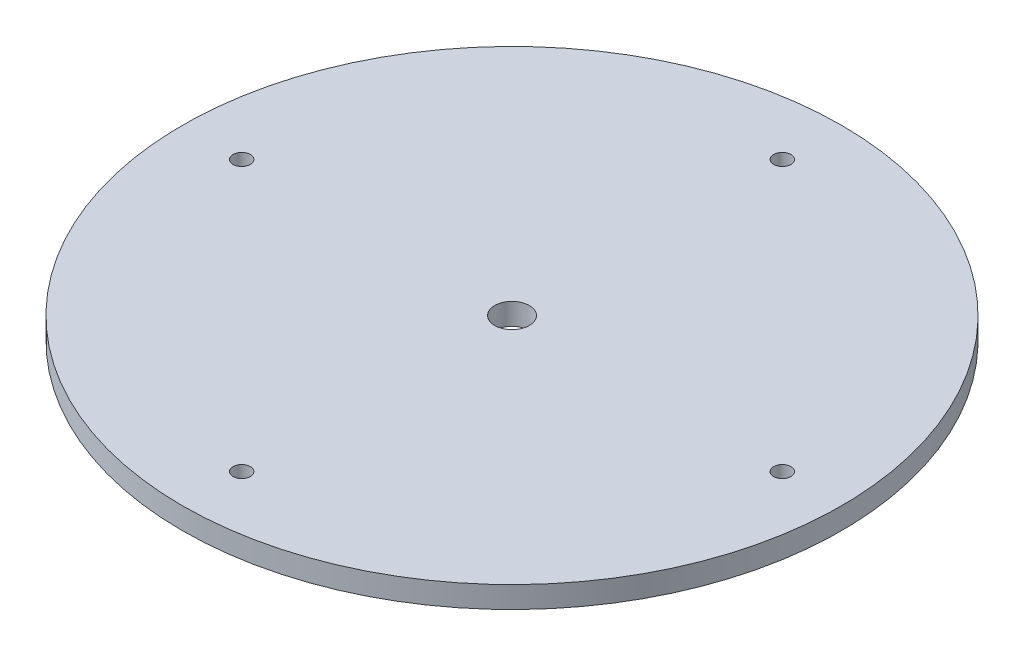
ISO-10303-21;
HEADER;
FILE_DESCRIPTION(('STEP AP214'),'2;1');
FILE_NAME('part.step','',(''),(''),'','','');
FILE_SCHEMA(('AUTOMOTIVE_DESIGN { 1 0 10303 214 1 1 1 1 }'));
ENDSEC;
DATA;
#1=APPLICATION_CONTEXT('core data for automotive mechanical design processes');
#2=APPLICATION_PROTOCOL_DEFINITION('international standard','automotive_design',2000,#1);
#3=PRODUCT_CONTEXT('',#1,'mechanical');
#4=PRODUCT('Part','Part','',(#3));
#5=PRODUCT_RELATED_PRODUCT_CATEGORY('part','',(#4));
#6=PRODUCT_DEFINITION_FORMATION('','',#4);
#7=PRODUCT_DEFINITION_CONTEXT('part definition',#1,'design');
#8=PRODUCT_DEFINITION('design','',#6,#7);
#9=PRODUCT_DEFINITION_SHAPE('','',#8);
#10=(LENGTH_UNIT() NAMED_UNIT(*) SI_UNIT(.MILLI.,.METRE.));
#11=(NAMED_UNIT(*) PLANE_ANGLE_UNIT() SI_UNIT($,.RADIAN.));
#12=(NAMED_UNIT(*) SI_UNIT($,.STERADIAN.) SOLID_ANGLE_UNIT());
#13=UNCERTAINTY_MEASURE_WITH_UNIT(LENGTH_MEASURE(1.E-05),#10,'distance_accuracy_value','');
#14=(GEOMETRIC_REPRESENTATION_CONTEXT(3) GLOBAL_UNCERTAINTY_ASSIGNED_CONTEXT((#13)) GLOBAL_UNIT_ASSIGNED_CONTEXT((#10,
#11,#12)) REPRESENTATION_CONTEXT('',''));
#15=CARTESIAN_POINT('',(0.,0.,0.));
#16=DIRECTION('',(0.,0.,1.));
#17=DIRECTION('',(1.,0.,0.));
#18=AXIS2_PLACEMENT_3D('',#15,#16,#17);
#19=CARTESIAN_POINT('',(0.,5.,0.));
#20=DIRECTION('',(0.,-1.,0.));
#21=DIRECTION('',(0.,0.,-1.));
#22=AXIS2_PLACEMENT_3D('',#19,#20,#21);
#23=CYLINDRICAL_SURFACE('',#22,4.);
#24=CARTESIAN_POINT('',(0.,5.,0.));
#25=DIRECTION('',(0.,1.,0.));
#26=DIRECTION('',(0.,0.,1.));
#27=AXIS2_PLACEMENT_3D('',#24,#25,#26);
#28=CIRCLE('',#27,4.);
#29=CARTESIAN_POINT('',(0.,5.,4.));
#30=VERTEX_POINT('',#29);
#31=EDGE_CURVE('E48',#30,#30,#28,.T.);
#32=ORIENTED_EDGE('',*,*,#31,.T.);
#33=EDGE_LOOP('',(#32));
#34=FACE_BOUND('',#33,.T.);
#35=CARTESIAN_POINT('',(0.,0.,0.));
#36=DIRECTION('',(0.,1.,0.));
#37=DIRECTION('',(0.,0.,1.));
#38=AXIS2_PLACEMENT_3D('',#35,#36,#37);
#39=CIRCLE('',#38,4.);
#40=CARTESIAN_POINT('',(0.,0.,4.));
#41=VERTEX_POINT('',#40);
#42=EDGE_CURVE('E56',#41,#41,#39,.T.);
#43=ORIENTED_EDGE('',*,*,#42,.F.);
#44=EDGE_LOOP('',(#43));
#45=FACE_BOUND('',#44,.T.);
#46=ADVANCED_FACE('F40',(#34,#45),#23,.F.);
#47=CARTESIAN_POINT('',(0.,5.,0.));
#48=DIRECTION('',(0.,-1.,0.));
#49=DIRECTION('',(0.,0.,-1.));
#50=AXIS2_PLACEMENT_3D('',#47,#48,#49);
#51=CYLINDRICAL_SURFACE('',#50,76.2);
#52=CARTESIAN_POINT('',(0.,5.,0.));
#53=DIRECTION('',(0.,1.,0.));
#54=DIRECTION('',(0.,0.,1.));
#55=AXIS2_PLACEMENT_3D('',#52,#53,#54);
#56=CIRCLE('',#55,76.2);
#57=CARTESIAN_POINT('',(0.,5.,76.2));
#58=VERTEX_POINT('',#57);
#59=EDGE_CURVE('E10',#58,#58,#56,.T.);
#60=ORIENTED_EDGE('',*,*,#59,.F.);
#61=EDGE_LOOP('',(#60));
#62=FACE_BOUND('',#61,.T.);
#63=CARTESIAN_POINT('',(0.,0.,0.));
#64=DIRECTION('',(0.,1.,0.));
#65=DIRECTION('',(0.,0.,1.));
#66=AXIS2_PLACEMENT_3D('',#63,#64,#65);
#67=CIRCLE('',#66,76.2);
#68=CARTESIAN_POINT('',(0.,0.,76.2));
#69=VERTEX_POINT('',#68);
#70=EDGE_CURVE('E43',#69,#69,#67,.T.);
#71=ORIENTED_EDGE('',*,*,#70,.T.);
#72=EDGE_LOOP('',(#71));
#73=FACE_BOUND('',#72,.T.);
#74=ADVANCED_FACE('F104',(#62,#73),#51,.T.);
#75=CARTESIAN_POINT('',(0.,5.,0.));
#76=DIRECTION('',(0.,1.,0.));
#77=DIRECTION('',(0.,0.,1.));
#78=AXIS2_PLACEMENT_3D('',#75,#76,#77);
#79=PLANE('',#78);
#80=CARTESIAN_POINT('',(0.,5.,62.5));
#81=DIRECTION('',(0.,1.,0.));
#82=DIRECTION('',(0.,0.,1.));
#83=AXIS2_PLACEMENT_3D('',#80,#81,#82);
#84=CIRCLE('',#83,2.);
#85=CARTESIAN_POINT('',(0.,5.,64.5));
#86=VERTEX_POINT('',#85);
#87=EDGE_CURVE('E66',#86,#86,#84,.T.);
#88=ORIENTED_EDGE('',*,*,#87,.F.);
#89=EDGE_LOOP('',(#88));
#90=FACE_BOUND('',#89,.T.);
#91=CARTESIAN_POINT('',(-62.5,5.,0.));
#92=DIRECTION('',(0.,1.,0.));
#93=DIRECTION('',(0.,0.,1.));
#94=AXIS2_PLACEMENT_3D('',#91,#92,#93);
#95=CIRCLE('',#94,2.);
#96=CARTESIAN_POINT('',(-62.5,5.,2.));
#97=VERTEX_POINT('',#96);
#98=EDGE_CURVE('E78',#97,#97,#95,.T.);
#99=ORIENTED_EDGE('',*,*,#98,.F.);
#100=EDGE_LOOP('',(#99));
#101=FACE_BOUND('',#100,.T.);
#102=CARTESIAN_POINT('',(0.,5.,-62.5));
#103=DIRECTION('',(0.,1.,0.));
#104=DIRECTION('',(0.,0.,1.));
#105=AXIS2_PLACEMENT_3D('',#102,#103,#104);
#106=CIRCLE('',#105,2.);
#107=CARTESIAN_POINT('',(0.,5.,-60.5));
#108=VERTEX_POINT('',#107);
#109=EDGE_CURVE('E86',#108,#108,#106,.T.);
#110=ORIENTED_EDGE('',*,*,#109,.F.);
#111=EDGE_LOOP('',(#110));
#112=FACE_BOUND('',#111,.T.);
#113=CARTESIAN_POINT('',(62.5,5.,0.));
#114=DIRECTION('',(0.,1.,0.));
#115=DIRECTION('',(0.,0.,1.));
#116=AXIS2_PLACEMENT_3D('',#113,#114,#115);
#117=CIRCLE('',#116,2.);
#118=CARTESIAN_POINT('',(62.5,5.,1.99999999999999));
#119=VERTEX_POINT('',#118);
#120=EDGE_CURVE('E93',#119,#119,#117,.T.);
#121=ORIENTED_EDGE('',*,*,#120,.F.);
#122=EDGE_LOOP('',(#121));
#123=FACE_BOUND('',#122,.T.);
#124=ORIENTED_EDGE('',*,*,#31,.F.);
#125=EDGE_LOOP('',(#124));
#126=FACE_BOUND('',#125,.T.);
#127=ORIENTED_EDGE('',*,*,#59,.T.);
#128=EDGE_LOOP('',(#127));
#129=FACE_BOUND('',#128,.T.);
#130=ADVANCED_FACE('F100',(#90,#101,#112,#123,#126,#129),#79,.T.);
#131=CARTESIAN_POINT('',(0.,0.,0.));
#132=DIRECTION('',(0.,1.,0.));
#133=DIRECTION('',(0.,0.,1.));
#134=AXIS2_PLACEMENT_3D('',#131,#132,#133);
#135=PLANE('',#134);
#136=CARTESIAN_POINT('',(0.,0.,62.5));
#137=DIRECTION('',(0.,1.,0.));
#138=DIRECTION('',(0.,0.,1.));
#139=AXIS2_PLACEMENT_3D('',#136,#137,#138);
#140=CIRCLE('',#139,2.);
#141=CARTESIAN_POINT('',(0.,0.,64.5));
#142=VERTEX_POINT('',#141);
#143=EDGE_CURVE('E59',#142,#142,#140,.T.);
#144=ORIENTED_EDGE('',*,*,#143,.T.);
#145=EDGE_LOOP('',(#144));
#146=FACE_BOUND('',#145,.T.);
#147=CARTESIAN_POINT('',(-62.5,0.,0.));
#148=DIRECTION('',(0.,1.,0.));
#149=DIRECTION('',(0.,0.,1.));
#150=AXIS2_PLACEMENT_3D('',#147,#148,#149);
#151=CIRCLE('',#150,2.);
#152=CARTESIAN_POINT('',(-62.5,0.,2.));
#153=VERTEX_POINT('',#152);
#154=EDGE_CURVE('E72',#153,#153,#151,.T.);
#155=ORIENTED_EDGE('',*,*,#154,.T.);
#156=EDGE_LOOP('',(#155));
#157=FACE_BOUND('',#156,.T.);
#158=CARTESIAN_POINT('',(0.,0.,-62.5));
#159=DIRECTION('',(0.,1.,0.));
#160=DIRECTION('',(0.,0.,1.));
#161=AXIS2_PLACEMENT_3D('',#158,#159,#160);
#162=CIRCLE('',#161,2.);
#163=CARTESIAN_POINT('',(0.,0.,-60.5));
#164=VERTEX_POINT('',#163);
#165=EDGE_CURVE('E82',#164,#164,#162,.T.);
#166=ORIENTED_EDGE('',*,*,#165,.T.);
#167=EDGE_LOOP('',(#166));
#168=FACE_BOUND('',#167,.T.);
#169=CARTESIAN_POINT('',(62.5,0.,0.));
#170=DIRECTION('',(0.,1.,0.));
#171=DIRECTION('',(0.,0.,1.));
#172=AXIS2_PLACEMENT_3D('',#169,#170,#171);
#173=CIRCLE('',#172,2.);
#174=CARTESIAN_POINT('',(62.5,0.,1.99999999999999));
#175=VERTEX_POINT('',#174);
#176=EDGE_CURVE('E90',#175,#175,#173,.T.);
#177=ORIENTED_EDGE('',*,*,#176,.T.);
#178=EDGE_LOOP('',(#177));
#179=FACE_BOUND('',#178,.T.);
#180=ORIENTED_EDGE('',*,*,#42,.T.);
#181=EDGE_LOOP('',(#180));
#182=FACE_BOUND('',#181,.T.);
#183=ORIENTED_EDGE('',*,*,#70,.F.);
#184=EDGE_LOOP('',(#183));
#185=FACE_BOUND('',#184,.T.);
#186=ADVANCED_FACE('F103',(#146,#157,#168,#179,#182,#185),#135,.F.);
#187=CARTESIAN_POINT('',(62.5,0.,0.));
#188=DIRECTION('',(0.,1.,0.));
#189=DIRECTION('',(0.,0.,1.));
#190=AXIS2_PLACEMENT_3D('',#187,#188,#189);
#191=CYLINDRICAL_SURFACE('',#190,2.);
#192=ORIENTED_EDGE('',*,*,#176,.F.);
#193=EDGE_LOOP('',(#192));
#194=FACE_BOUND('',#193,.T.);
#195=ORIENTED_EDGE('',*,*,#120,.T.);
#196=EDGE_LOOP('',(#195));
#197=FACE_BOUND('',#196,.T.);
#198=ADVANCED_FACE('F98',(#194,#197),#191,.F.);
#199=CARTESIAN_POINT('',(0.,0.,-62.5));
#200=DIRECTION('',(0.,1.,0.));
#201=DIRECTION('',(0.,0.,1.));
#202=AXIS2_PLACEMENT_3D('',#199,#200,#201);
#203=CYLINDRICAL_SURFACE('',#202,2.);
#204=ORIENTED_EDGE('',*,*,#165,.F.);
#205=EDGE_LOOP('',(#204));
#206=FACE_BOUND('',#205,.T.);
#207=ORIENTED_EDGE('',*,*,#109,.T.);
#208=EDGE_LOOP('',(#207));
#209=FACE_BOUND('',#208,.T.);
#210=ADVANCED_FACE('F123',(#206,#209),#203,.F.);
#211=CARTESIAN_POINT('',(-62.5,0.,0.));
#212=DIRECTION('',(0.,1.,0.));
#213=DIRECTION('',(0.,0.,1.));
#214=AXIS2_PLACEMENT_3D('',#211,#212,#213);
#215=CYLINDRICAL_SURFACE('',#214,2.);
#216=ORIENTED_EDGE('',*,*,#154,.F.);
#217=EDGE_LOOP('',(#216));
#218=FACE_BOUND('',#217,.T.);
#219=ORIENTED_EDGE('',*,*,#98,.T.);
#220=EDGE_LOOP('',(#219));
#221=FACE_BOUND('',#220,.T.);
#222=ADVANCED_FACE('F127',(#218,#221),#215,.F.);
#223=CARTESIAN_POINT('',(0.,0.,62.5));
#224=DIRECTION('',(0.,1.,0.));
#225=DIRECTION('',(0.,0.,1.));
#226=AXIS2_PLACEMENT_3D('',#223,#224,#225);
#227=CYLINDRICAL_SURFACE('',#226,2.);
#228=ORIENTED_EDGE('',*,*,#143,.F.);
#229=EDGE_LOOP('',(#228));
#230=FACE_BOUND('',#229,.T.);
#231=ORIENTED_EDGE('',*,*,#87,.T.);
#232=EDGE_LOOP('',(#231));
#233=FACE_BOUND('',#232,.T.);
#234=ADVANCED_FACE('F131',(#230,#233),#227,.F.);
#235=CLOSED_SHELL('',(#46,#74,#130,#186,#198,#210,#222,#234));
#236=MANIFOLD_SOLID_BREP('B2',#235);
#237=ADVANCED_BREP_SHAPE_REPRESENTATION('',(#18,#236),#14);
#238=SHAPE_DEFINITION_REPRESENTATION(#9,#237);
ENDSEC;
END-ISO-10303-21;
